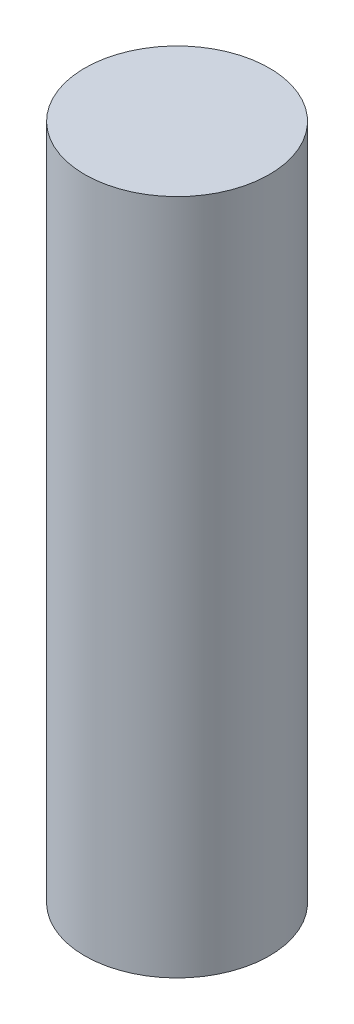
ISO-10303-21;
HEADER;
FILE_DESCRIPTION(('STEP AP214'),'2;1');
FILE_NAME('part.step','',(''),(''),'','','');
FILE_SCHEMA(('AUTOMOTIVE_DESIGN { 1 0 10303 214 1 1 1 1 }'));
ENDSEC;
DATA;
#1=APPLICATION_CONTEXT('core data for automotive mechanical design processes');
#2=APPLICATION_PROTOCOL_DEFINITION('international standard','automotive_design',2000,#1);
#3=PRODUCT_CONTEXT('',#1,'mechanical');
#4=PRODUCT('Part','Part','',(#3));
#5=PRODUCT_RELATED_PRODUCT_CATEGORY('part','',(#4));
#6=PRODUCT_DEFINITION_FORMATION('','',#4);
#7=PRODUCT_DEFINITION_CONTEXT('part definition',#1,'design');
#8=PRODUCT_DEFINITION('design','',#6,#7);
#9=PRODUCT_DEFINITION_SHAPE('','',#8);
#10=(LENGTH_UNIT() NAMED_UNIT(*) SI_UNIT(.MILLI.,.METRE.));
#11=(NAMED_UNIT(*) PLANE_ANGLE_UNIT() SI_UNIT($,.RADIAN.));
#12=(NAMED_UNIT(*) SI_UNIT($,.STERADIAN.) SOLID_ANGLE_UNIT());
#13=UNCERTAINTY_MEASURE_WITH_UNIT(LENGTH_MEASURE(1.E-05),#10,'distance_accuracy_value','');
#14=(GEOMETRIC_REPRESENTATION_CONTEXT(3) GLOBAL_UNCERTAINTY_ASSIGNED_CONTEXT((#13)) GLOBAL_UNIT_ASSIGNED_CONTEXT((#10,
#11,#12)) REPRESENTATION_CONTEXT('',''));
#15=CARTESIAN_POINT('',(0.,0.,0.));
#16=DIRECTION('',(0.,0.,1.));
#17=DIRECTION('',(1.,0.,0.));
#18=AXIS2_PLACEMENT_3D('',#15,#16,#17);
#19=CARTESIAN_POINT('',(0.,11.,0.));
#20=DIRECTION('',(0.,-1.,0.));
#21=DIRECTION('',(0.,0.,-1.));
#22=AXIS2_PLACEMENT_3D('',#19,#20,#21);
#23=CYLINDRICAL_SURFACE('',#22,1.5);
#24=CARTESIAN_POINT('',(0.,11.,0.));
#25=DIRECTION('',(0.,1.,0.));
#26=DIRECTION('',(0.,0.,1.));
#27=AXIS2_PLACEMENT_3D('',#24,#25,#26);
#28=CIRCLE('',#27,1.5);
#29=CARTESIAN_POINT('',(0.,11.,1.5));
#30=VERTEX_POINT('',#29);
#31=EDGE_CURVE('E10',#30,#30,#28,.T.);
#32=ORIENTED_EDGE('',*,*,#31,.F.);
#33=EDGE_LOOP('',(#32));
#34=FACE_BOUND('',#33,.T.);
#35=CARTESIAN_POINT('',(0.,0.,0.));
#36=DIRECTION('',(0.,1.,0.));
#37=DIRECTION('',(0.,0.,1.));
#38=AXIS2_PLACEMENT_3D('',#35,#36,#37);
#39=CIRCLE('',#38,1.5);
#40=CARTESIAN_POINT('',(0.,0.,1.5));
#41=VERTEX_POINT('',#40);
#42=EDGE_CURVE('E34',#41,#41,#39,.T.);
#43=ORIENTED_EDGE('',*,*,#42,.T.);
#44=EDGE_LOOP('',(#43));
#45=FACE_BOUND('',#44,.T.);
#46=ADVANCED_FACE('F31',(#34,#45),#23,.T.);
#47=CARTESIAN_POINT('',(0.,11.,0.));
#48=DIRECTION('',(0.,1.,0.));
#49=DIRECTION('',(0.,0.,1.));
#50=AXIS2_PLACEMENT_3D('',#47,#48,#49);
#51=PLANE('',#50);
#52=ORIENTED_EDGE('',*,*,#31,.T.);
#53=EDGE_LOOP('',(#52));
#54=FACE_BOUND('',#53,.T.);
#55=ADVANCED_FACE('F46',(#54),#51,.T.);
#56=CARTESIAN_POINT('',(0.,0.,0.));
#57=DIRECTION('',(0.,1.,0.));
#58=DIRECTION('',(0.,0.,1.));
#59=AXIS2_PLACEMENT_3D('',#56,#57,#58);
#60=PLANE('',#59);
#61=ORIENTED_EDGE('',*,*,#42,.F.);
#62=EDGE_LOOP('',(#61));
#63=FACE_BOUND('',#62,.T.);
#64=ADVANCED_FACE('F44',(#63),#60,.F.);
#65=CLOSED_SHELL('',(#46,#55,#64));
#66=MANIFOLD_SOLID_BREP('B2',#65);
#67=ADVANCED_BREP_SHAPE_REPRESENTATION('',(#18,#66),#14);
#68=SHAPE_DEFINITION_REPRESENTATION(#9,#67);
ENDSEC;
END-ISO-10303-21;
